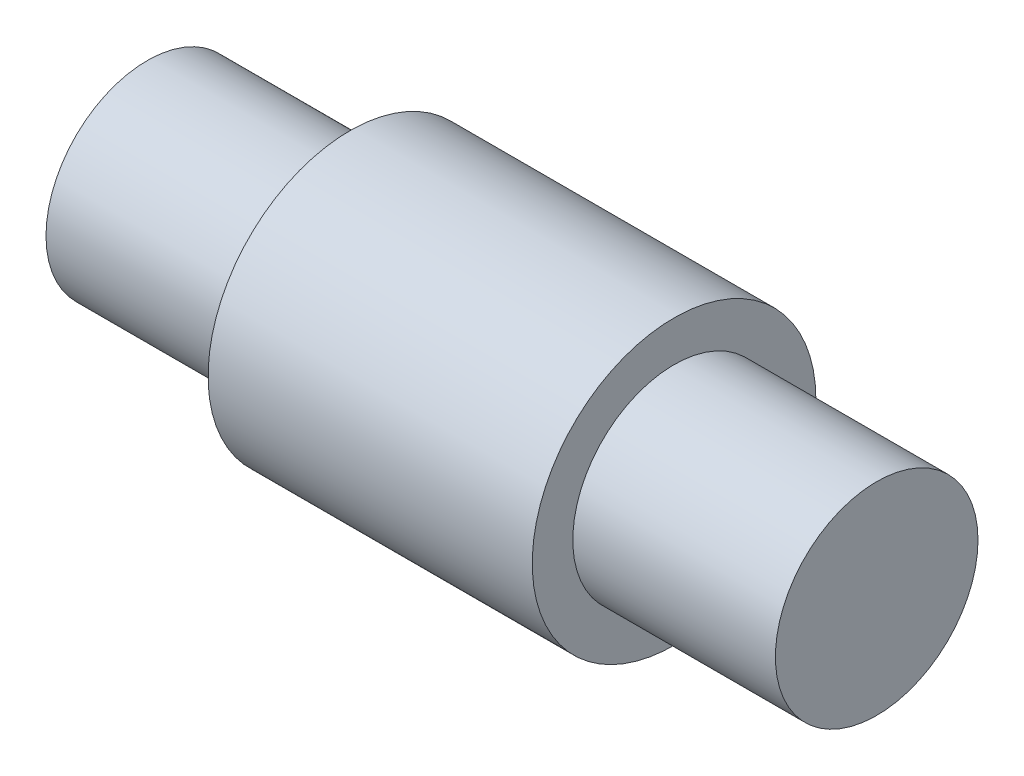
ISO-10303-21;
HEADER;
FILE_DESCRIPTION(('STEP AP214'),'2;1');
FILE_NAME('part.step','',(''),(''),'','','');
FILE_SCHEMA(('AUTOMOTIVE_DESIGN { 1 0 10303 214 1 1 1 1 }'));
ENDSEC;
DATA;
#1=APPLICATION_CONTEXT('core data for automotive mechanical design processes');
#2=APPLICATION_PROTOCOL_DEFINITION('international standard','automotive_design',2000,#1);
#3=PRODUCT_CONTEXT('',#1,'mechanical');
#4=PRODUCT('Part','Part','',(#3));
#5=PRODUCT_RELATED_PRODUCT_CATEGORY('part','',(#4));
#6=PRODUCT_DEFINITION_FORMATION('','',#4);
#7=PRODUCT_DEFINITION_CONTEXT('part definition',#1,'design');
#8=PRODUCT_DEFINITION('design','',#6,#7);
#9=PRODUCT_DEFINITION_SHAPE('','',#8);
#10=(LENGTH_UNIT() NAMED_UNIT(*) SI_UNIT(.MILLI.,.METRE.));
#11=(NAMED_UNIT(*) PLANE_ANGLE_UNIT() SI_UNIT($,.RADIAN.));
#12=(NAMED_UNIT(*) SI_UNIT($,.STERADIAN.) SOLID_ANGLE_UNIT());
#13=UNCERTAINTY_MEASURE_WITH_UNIT(LENGTH_MEASURE(1.E-05),#10,'distance_accuracy_value','');
#14=(GEOMETRIC_REPRESENTATION_CONTEXT(3) GLOBAL_UNCERTAINTY_ASSIGNED_CONTEXT((#13)) GLOBAL_UNIT_ASSIGNED_CONTEXT((#10,
#11,#12)) REPRESENTATION_CONTEXT('',''));
#15=CARTESIAN_POINT('',(0.,0.,0.));
#16=DIRECTION('',(0.,0.,1.));
#17=DIRECTION('',(1.,0.,0.));
#18=AXIS2_PLACEMENT_3D('',#15,#16,#17);
#19=CARTESIAN_POINT('',(16.,0.,0.));
#20=DIRECTION('',(-1.,0.,0.));
#21=DIRECTION('',(0.,0.,1.));
#22=AXIS2_PLACEMENT_3D('',#19,#20,#21);
#23=CYLINDRICAL_SURFACE('',#22,7.);
#24=CARTESIAN_POINT('',(16.,0.,0.));
#25=DIRECTION('',(1.,0.,0.));
#26=DIRECTION('',(0.,0.,-1.));
#27=AXIS2_PLACEMENT_3D('',#24,#25,#26);
#28=CIRCLE('',#27,7.);
#29=CARTESIAN_POINT('',(16.,0.,-7.));
#30=VERTEX_POINT('',#29);
#31=EDGE_CURVE('E49',#30,#30,#28,.T.);
#32=ORIENTED_EDGE('',*,*,#31,.F.);
#33=EDGE_LOOP('',(#32));
#34=FACE_BOUND('',#33,.T.);
#35=CARTESIAN_POINT('',(0.,0.,0.));
#36=DIRECTION('',(1.,0.,0.));
#37=DIRECTION('',(0.,0.,-1.));
#38=AXIS2_PLACEMENT_3D('',#35,#36,#37);
#39=CIRCLE('',#38,7.);
#40=CARTESIAN_POINT('',(0.,0.,-7.));
#41=VERTEX_POINT('',#40);
#42=EDGE_CURVE('E40',#41,#41,#39,.T.);
#43=ORIENTED_EDGE('',*,*,#42,.T.);
#44=EDGE_LOOP('',(#43));
#45=FACE_BOUND('',#44,.T.);
#46=ADVANCED_FACE('F37',(#34,#45),#23,.T.);
#47=CARTESIAN_POINT('',(16.,0.,0.));
#48=DIRECTION('',(1.,0.,0.));
#49=DIRECTION('',(0.,0.,-1.));
#50=AXIS2_PLACEMENT_3D('',#47,#48,#49);
#51=PLANE('',#50);
#52=CARTESIAN_POINT('',(16.,0.,0.));
#53=DIRECTION('',(1.,0.,0.));
#54=DIRECTION('',(0.,0.,-1.));
#55=AXIS2_PLACEMENT_3D('',#52,#53,#54);
#56=CIRCLE('',#55,5.);
#57=CARTESIAN_POINT('',(16.,0.,-5.));
#58=VERTEX_POINT('',#57);
#59=EDGE_CURVE('E44',#58,#58,#56,.T.);
#60=ORIENTED_EDGE('',*,*,#59,.F.);
#61=EDGE_LOOP('',(#60));
#62=FACE_BOUND('',#61,.T.);
#63=ORIENTED_EDGE('',*,*,#31,.T.);
#64=EDGE_LOOP('',(#63));
#65=FACE_BOUND('',#64,.T.);
#66=ADVANCED_FACE('F66',(#62,#65),#51,.T.);
#67=CARTESIAN_POINT('',(0.,0.,0.));
#68=DIRECTION('',(1.,0.,0.));
#69=DIRECTION('',(0.,0.,-1.));
#70=AXIS2_PLACEMENT_3D('',#67,#68,#69);
#71=PLANE('',#70);
#72=CARTESIAN_POINT('',(0.,0.,0.));
#73=DIRECTION('',(-1.,0.,0.));
#74=DIRECTION('',(0.,0.,1.));
#75=AXIS2_PLACEMENT_3D('',#72,#73,#74);
#76=CIRCLE('',#75,5.);
#77=CARTESIAN_POINT('',(0.,0.,5.));
#78=VERTEX_POINT('',#77);
#79=EDGE_CURVE('E10',#78,#78,#76,.T.);
#80=ORIENTED_EDGE('',*,*,#79,.F.);
#81=EDGE_LOOP('',(#80));
#82=FACE_BOUND('',#81,.T.);
#83=ORIENTED_EDGE('',*,*,#42,.F.);
#84=EDGE_LOOP('',(#83));
#85=FACE_BOUND('',#84,.T.);
#86=ADVANCED_FACE('F63',(#82,#85),#71,.F.);
#87=CARTESIAN_POINT('',(26.,0.,0.));
#88=DIRECTION('',(-1.,0.,0.));
#89=DIRECTION('',(0.,0.,1.));
#90=AXIS2_PLACEMENT_3D('',#87,#88,#89);
#91=CYLINDRICAL_SURFACE('',#90,5.);
#92=CARTESIAN_POINT('',(26.,0.,0.));
#93=DIRECTION('',(1.,0.,0.));
#94=DIRECTION('',(0.,0.,-1.));
#95=AXIS2_PLACEMENT_3D('',#92,#93,#94);
#96=CIRCLE('',#95,5.);
#97=CARTESIAN_POINT('',(26.,0.,-5.));
#98=VERTEX_POINT('',#97);
#99=EDGE_CURVE('E54',#98,#98,#96,.T.);
#100=ORIENTED_EDGE('',*,*,#99,.F.);
#101=EDGE_LOOP('',(#100));
#102=FACE_BOUND('',#101,.T.);
#103=ORIENTED_EDGE('',*,*,#59,.T.);
#104=EDGE_LOOP('',(#103));
#105=FACE_BOUND('',#104,.T.);
#106=ADVANCED_FACE('F65',(#102,#105),#91,.T.);
#107=CARTESIAN_POINT('',(26.,0.,0.));
#108=DIRECTION('',(1.,0.,0.));
#109=DIRECTION('',(0.,0.,-1.));
#110=AXIS2_PLACEMENT_3D('',#107,#108,#109);
#111=PLANE('',#110);
#112=ORIENTED_EDGE('',*,*,#99,.T.);
#113=EDGE_LOOP('',(#112));
#114=FACE_BOUND('',#113,.T.);
#115=ADVANCED_FACE('F73',(#114),#111,.T.);
#116=CARTESIAN_POINT('',(-10.,0.,0.));
#117=DIRECTION('',(1.,0.,0.));
#118=DIRECTION('',(0.,0.,-1.));
#119=AXIS2_PLACEMENT_3D('',#116,#117,#118);
#120=CYLINDRICAL_SURFACE('',#119,5.);
#121=CARTESIAN_POINT('',(-10.,0.,0.));
#122=DIRECTION('',(-1.,0.,0.));
#123=DIRECTION('',(0.,0.,1.));
#124=AXIS2_PLACEMENT_3D('',#121,#122,#123);
#125=CIRCLE('',#124,5.);
#126=CARTESIAN_POINT('',(-10.,0.,5.));
#127=VERTEX_POINT('',#126);
#128=EDGE_CURVE('E53',#127,#127,#125,.T.);
#129=ORIENTED_EDGE('',*,*,#128,.F.);
#130=EDGE_LOOP('',(#129));
#131=FACE_BOUND('',#130,.T.);
#132=ORIENTED_EDGE('',*,*,#79,.T.);
#133=EDGE_LOOP('',(#132));
#134=FACE_BOUND('',#133,.T.);
#135=ADVANCED_FACE('F98',(#131,#134),#120,.T.);
#136=CARTESIAN_POINT('',(-10.,0.,0.));
#137=DIRECTION('',(-1.,0.,0.));
#138=DIRECTION('',(0.,0.,1.));
#139=AXIS2_PLACEMENT_3D('',#136,#137,#138);
#140=PLANE('',#139);
#141=ORIENTED_EDGE('',*,*,#128,.T.);
#142=EDGE_LOOP('',(#141));
#143=FACE_BOUND('',#142,.T.);
#144=ADVANCED_FACE('F110',(#143),#140,.T.);
#145=CLOSED_SHELL('',(#46,#66,#86,#106,#115,#135,#144));
#146=MANIFOLD_SOLID_BREP('B2',#145);
#147=ADVANCED_BREP_SHAPE_REPRESENTATION('',(#18,#146),#14);
#148=SHAPE_DEFINITION_REPRESENTATION(#9,#147);
ENDSEC;
END-ISO-10303-21;
